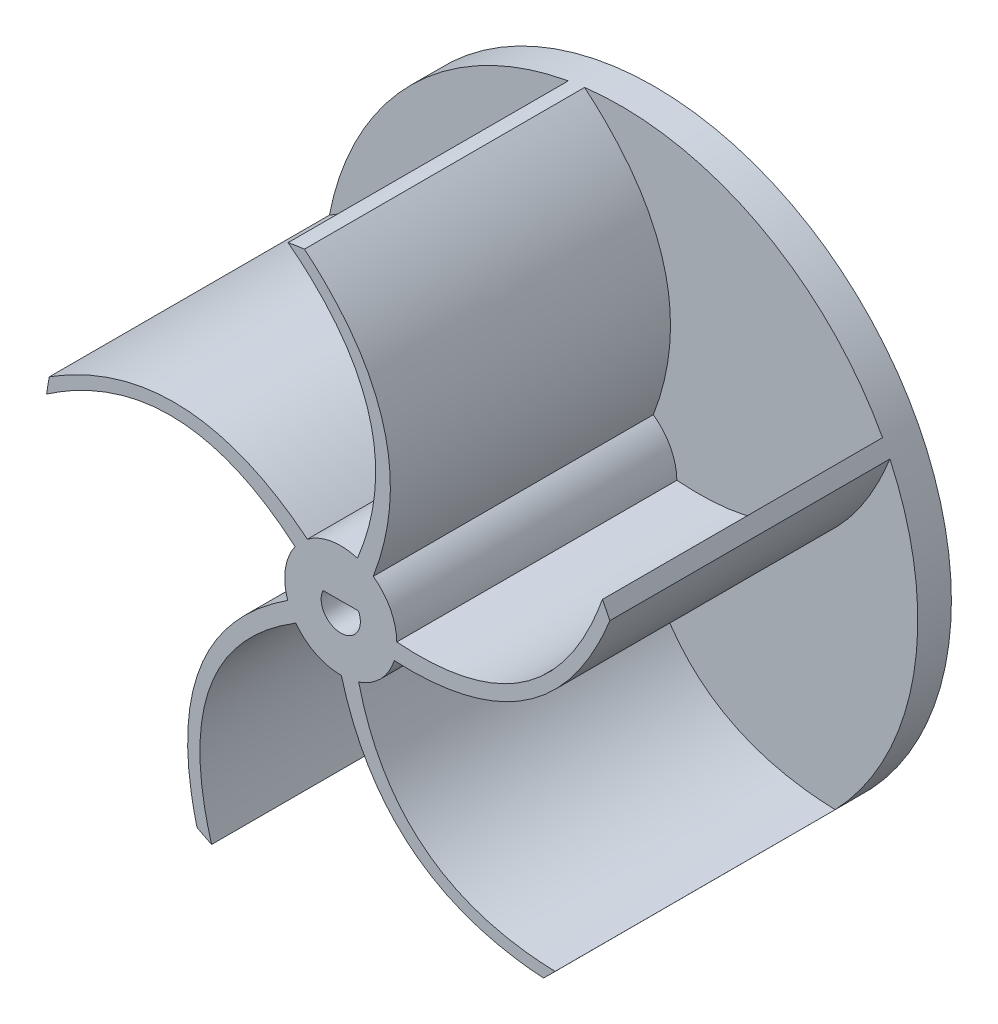
ISO-10303-21;
HEADER;
FILE_DESCRIPTION(('STEP AP214'),'2;1');
FILE_NAME('part.step','',(''),(''),'','','');
FILE_SCHEMA(('AUTOMOTIVE_DESIGN { 1 0 10303 214 1 1 1 1 }'));
ENDSEC;
DATA;
#1=APPLICATION_CONTEXT('core data for automotive mechanical design processes');
#2=APPLICATION_PROTOCOL_DEFINITION('international standard','automotive_design',2000,#1);
#3=PRODUCT_CONTEXT('',#1,'mechanical');
#4=PRODUCT('Part','Part','',(#3));
#5=PRODUCT_RELATED_PRODUCT_CATEGORY('part','',(#4));
#6=PRODUCT_DEFINITION_FORMATION('','',#4);
#7=PRODUCT_DEFINITION_CONTEXT('part definition',#1,'design');
#8=PRODUCT_DEFINITION('design','',#6,#7);
#9=PRODUCT_DEFINITION_SHAPE('','',#8);
#10=(LENGTH_UNIT() NAMED_UNIT(*) SI_UNIT(.MILLI.,.METRE.));
#11=(NAMED_UNIT(*) PLANE_ANGLE_UNIT() SI_UNIT($,.RADIAN.));
#12=(NAMED_UNIT(*) SI_UNIT($,.STERADIAN.) SOLID_ANGLE_UNIT());
#13=UNCERTAINTY_MEASURE_WITH_UNIT(LENGTH_MEASURE(1.E-05),#10,'distance_accuracy_value','');
#14=(GEOMETRIC_REPRESENTATION_CONTEXT(3) GLOBAL_UNCERTAINTY_ASSIGNED_CONTEXT((#13)) GLOBAL_UNIT_ASSIGNED_CONTEXT((#10,
#11,#12)) REPRESENTATION_CONTEXT('',''));
#15=CARTESIAN_POINT('',(0.,0.,0.));
#16=DIRECTION('',(0.,0.,1.));
#17=DIRECTION('',(1.,0.,0.));
#18=AXIS2_PLACEMENT_3D('',#15,#16,#17);
#19=CARTESIAN_POINT('',(0.,0.,3.));
#20=DIRECTION('',(0.,0.,1.));
#21=DIRECTION('',(1.,0.,0.));
#22=AXIS2_PLACEMENT_3D('',#19,#20,#21);
#23=PLANE('',#22);
#24=CARTESIAN_POINT('',(0.,0.,3.));
#25=DIRECTION('',(0.,0.,1.));
#26=DIRECTION('',(1.,0.,0.));
#27=AXIS2_PLACEMENT_3D('',#24,#25,#26);
#28=CIRCLE('',#27,26.5);
#29=CARTESIAN_POINT('',(19.1298908532187,-18.3384098532,3.));
#30=VERTEX_POINT('',#29);
#31=CARTESIAN_POINT('',(24.0121431598113,11.2101284949248,3.));
#32=VERTEX_POINT('',#31);
#33=EDGE_CURVE('E247',#30,#32,#28,.T.);
#34=ORIENTED_EDGE('',*,*,#33,.T.);
#35=CARTESIAN_POINT('',(4.77107145055843,-1.49561934117146,3.));
#36=CARTESIAN_POINT('',(14.0360550496046,-1.95933172216085,3.));
#37=CARTESIAN_POINT('',(20.4497456193296,2.27591755654129,3.));
#38=CARTESIAN_POINT('',(24.0121431598113,11.2101284949248,3.));
#39=B_SPLINE_CURVE_WITH_KNOTS('',3,(#35,#36,#37,#38),.UNSPECIFIED.,.F.,.F.,(4,4),
(0.132924516693897,1.),.UNSPECIFIED.);
#40=CARTESIAN_POINT('',(4.77107145055653,-1.49561934117087,3.));
#41=VERTEX_POINT('',#40);
#42=EDGE_CURVE('E695',#41,#32,#39,.T.);
#43=ORIENTED_EDGE('',*,*,#42,.F.);
#44=CARTESIAN_POINT('',(0.,0.,3.));
#45=DIRECTION('',(0.,0.,1.));
#46=DIRECTION('',(1.,0.,0.));
#47=AXIS2_PLACEMENT_3D('',#44,#45,#46);
#48=CIRCLE('',#47,5.);
#49=CARTESIAN_POINT('',(1.59844943323803,-4.73761115008197,3.));
#50=VERTEX_POINT('',#49);
#51=EDGE_CURVE('E210',#50,#41,#48,.T.);
#52=ORIENTED_EDGE('',*,*,#51,.F.);
#53=CARTESIAN_POINT('',(1.59844943323867,-4.73761115008386,3.));
#54=CARTESIAN_POINT('',(3.70972851772338,-13.523010784881,3.));
#55=CARTESIAN_POINT('',(9.553542324389,-18.0566103526065,3.));
#56=CARTESIAN_POINT('',(19.1298908532187,-18.3384098532,3.));
#57=B_SPLINE_CURVE_WITH_KNOTS('',3,(#53,#54,#55,#56),.UNSPECIFIED.,.F.,.F.,(4,4),
(0.156414662281996,1.),.UNSPECIFIED.);
#58=EDGE_CURVE('E712',#50,#30,#57,.T.);
#59=ORIENTED_EDGE('',*,*,#58,.T.);
#60=EDGE_LOOP('',(#34,#43,#52,#59));
#61=FACE_BOUND('',#60,.T.);
#62=ADVANCED_FACE('F41',(#61),#23,.T.);
#63=CARTESIAN_POINT('',(0.,0.,28.));
#64=DIRECTION('',(0.,0.,-1.));
#65=DIRECTION('',(-1.,0.,0.));
#66=AXIS2_PLACEMENT_3D('',#63,#64,#65);
#67=CYLINDRICAL_SURFACE('',#66,5.);
#68=DIRECTION('',(0.,0.,-1.));
#69=VECTOR('',#68,1.);
#70=CARTESIAN_POINT('',(4.77107145055653,-1.49561934117087,28.));
#71=LINE('',#70,#69);
#72=CARTESIAN_POINT('',(4.77107145055653,-1.49561934117087,28.));
#73=VERTEX_POINT('',#72);
#74=EDGE_CURVE('E195',#73,#41,#71,.T.);
#75=ORIENTED_EDGE('',*,*,#74,.F.);
#76=CARTESIAN_POINT('',(0.,0.,28.));
#77=DIRECTION('',(0.,0.,1.));
#78=DIRECTION('',(1.,0.,0.));
#79=AXIS2_PLACEMENT_3D('',#76,#77,#78);
#80=CIRCLE('',#79,5.);
#81=CARTESIAN_POINT('',(1.59844943323803,-4.73761115008197,28.));
#82=VERTEX_POINT('',#81);
#83=EDGE_CURVE('E208',#82,#73,#80,.T.);
#84=ORIENTED_EDGE('',*,*,#83,.F.);
#85=DIRECTION('',(0.,0.,-1.));
#86=VECTOR('',#85,1.);
#87=CARTESIAN_POINT('',(1.59844943323803,-4.73761115008197,28.));
#88=LINE('',#87,#86);
#89=EDGE_CURVE('E749',#82,#50,#88,.T.);
#90=ORIENTED_EDGE('',*,*,#89,.T.);
#91=ORIENTED_EDGE('',*,*,#51,.T.);
#92=EDGE_LOOP('',(#75,#84,#90,#91));
#93=FACE_BOUND('',#92,.T.);
#94=ADVANCED_FACE('F206',(#93),#67,.T.);
#95=CARTESIAN_POINT('',(-11.5294028151947,-23.8604876464204,3.));
#96=VERTEX_POINT('',#95);
#97=CARTESIAN_POINT('',(18.08162606135,-19.3727850082921,3.));
#98=VERTEX_POINT('',#97);
#99=EDGE_CURVE('E255',#96,#98,#28,.T.);
#100=ORIENTED_EDGE('',*,*,#99,.T.);
#101=CARTESIAN_POINT('',(0.051923639281489,-4.99973038630121,3.));
#102=CARTESIAN_POINT('',(2.47394434236521,-13.9545484177696,3.));
#103=CARTESIAN_POINT('',(8.48384514971659,-18.7455666250742,3.));
#104=CARTESIAN_POINT('',(18.08162606135,-19.3727850082921,3.));
#105=B_SPLINE_CURVE_WITH_KNOTS('',3,(#101,#102,#103,#104),.UNSPECIFIED.,.F.,.F.,(4,4),
(0.132924516693897,1.),.UNSPECIFIED.);
#106=CARTESIAN_POINT('',(0.0519236392814691,-4.99973038629922,3.));
#107=VERTEX_POINT('',#106);
#108=EDGE_CURVE('E719',#107,#98,#105,.T.);
#109=ORIENTED_EDGE('',*,*,#108,.F.);
#110=CARTESIAN_POINT('',(-4.01178791643849,-2.98421810756488,3.));
#111=VERTEX_POINT('',#110);
#112=EDGE_CURVE('E406',#111,#107,#48,.T.);
#113=ORIENTED_EDGE('',*,*,#112,.F.);
#114=CARTESIAN_POINT('',(-4.01178791644009,-2.98421810756607,3.));
#115=CARTESIAN_POINT('',(-11.7147783703968,-7.70700162811067,3.));
#116=CARTESIAN_POINT('',(-14.2206500033324,-14.6657581410737,3.));
#117=CARTESIAN_POINT('',(-11.5294028151947,-23.8604876464204,3.));
#118=B_SPLINE_CURVE_WITH_KNOTS('',3,(#114,#115,#116,#117),.UNSPECIFIED.,.F.,.F.,(4,4),
(0.156414662281996,1.),.UNSPECIFIED.);
#119=EDGE_CURVE('E745',#111,#96,#118,.T.);
#120=ORIENTED_EDGE('',*,*,#119,.T.);
#121=EDGE_LOOP('',(#100,#109,#113,#120));
#122=FACE_BOUND('',#121,.T.);
#123=ADVANCED_FACE('F435',(#122),#23,.T.);
#124=DIRECTION('',(0.,0.,-1.));
#125=VECTOR('',#124,1.);
#126=CARTESIAN_POINT('',(0.0519236392814691,-4.99973038629922,28.));
#127=LINE('',#126,#125);
#128=CARTESIAN_POINT('',(0.0519236392814691,-4.99973038629922,28.));
#129=VERTEX_POINT('',#128);
#130=EDGE_CURVE('E771',#129,#107,#127,.T.);
#131=ORIENTED_EDGE('',*,*,#130,.F.);
#132=CARTESIAN_POINT('',(-4.01178791643849,-2.98421810756488,28.));
#133=VERTEX_POINT('',#132);
#134=EDGE_CURVE('E217',#133,#129,#80,.T.);
#135=ORIENTED_EDGE('',*,*,#134,.F.);
#136=DIRECTION('',(0.,0.,-1.));
#137=VECTOR('',#136,1.);
#138=CARTESIAN_POINT('',(-4.01178791643849,-2.98421810756488,28.));
#139=LINE('',#138,#137);
#140=EDGE_CURVE('E295',#133,#111,#139,.T.);
#141=ORIENTED_EDGE('',*,*,#140,.T.);
#142=ORIENTED_EDGE('',*,*,#112,.T.);
#143=EDGE_LOOP('',(#131,#135,#141,#142));
#144=FACE_BOUND('',#143,.T.);
#145=ADVANCED_FACE('F442',(#144),#67,.T.);
#146=CARTESIAN_POINT('',(-26.2554536629977,3.59181749956531,3.));
#147=VERTEX_POINT('',#146);
#148=CARTESIAN_POINT('',(-12.8370836820312,-23.1831680867936,3.));
#149=VERTEX_POINT('',#148);
#150=EDGE_CURVE('E51',#147,#149,#28,.T.);
#151=ORIENTED_EDGE('',*,*,#150,.T.);
#152=CARTESIAN_POINT('',(-4.73898087666289,-1.5943839721483,3.));
#153=CARTESIAN_POINT('',(-12.5070733597475,-6.66505349767677,3.));
#154=CARTESIAN_POINT('',(-15.2064409615139,-13.8613148692127,3.));
#155=CARTESIAN_POINT('',(-12.8370836820312,-23.1831680867937,3.));
#156=B_SPLINE_CURVE_WITH_KNOTS('',3,(#152,#153,#154,#155),.UNSPECIFIED.,.F.,.F.,(4,4),
(0.132924516693897,1.),.UNSPECIFIED.);
#157=CARTESIAN_POINT('',(-4.738980876661,-1.59438397214767,3.));
#158=VERTEX_POINT('',#157);
#159=EDGE_CURVE('E273',#158,#149,#156,.T.);
#160=ORIENTED_EDGE('',*,*,#159,.F.);
#161=CARTESIAN_POINT('',(-4.07787072125312,2.893262929764,3.));
#162=VERTEX_POINT('',#161);
#163=EDGE_CURVE('E235',#162,#158,#48,.T.);
#164=ORIENTED_EDGE('',*,*,#163,.F.);
#165=CARTESIAN_POINT('',(-4.07787072125474,2.89326292976515,3.));
#166=CARTESIAN_POINT('',(-10.9498597213007,8.75982182735788,3.));
#167=CARTESIAN_POINT('',(-18.3423873685647,8.99267335063755,3.));
#168=CARTESIAN_POINT('',(-26.2554536629977,3.5918174995653,3.));
#169=B_SPLINE_CURVE_WITH_KNOTS('',3,(#165,#166,#167,#168),.UNSPECIFIED.,.F.,.F.,(4,4),
(0.156414662281996,1.),.UNSPECIFIED.);
#170=EDGE_CURVE('E275',#162,#147,#169,.T.);
#171=ORIENTED_EDGE('',*,*,#170,.T.);
#172=EDGE_LOOP('',(#151,#160,#164,#171));
#173=FACE_BOUND('',#172,.T.);
#174=ADVANCED_FACE('F271',(#173),#23,.T.);
#175=DIRECTION('',(0.,0.,-1.));
#176=VECTOR('',#175,1.);
#177=CARTESIAN_POINT('',(-4.738980876661,-1.59438397214767,28.));
#178=LINE('',#177,#176);
#179=CARTESIAN_POINT('',(-4.738980876661,-1.59438397214767,28.));
#180=VERTEX_POINT('',#179);
#181=EDGE_CURVE('E290',#180,#158,#178,.T.);
#182=ORIENTED_EDGE('',*,*,#181,.F.);
#183=CARTESIAN_POINT('',(-4.07787072125312,2.893262929764,28.));
#184=VERTEX_POINT('',#183);
#185=EDGE_CURVE('E223',#184,#180,#80,.T.);
#186=ORIENTED_EDGE('',*,*,#185,.F.);
#187=DIRECTION('',(0.,0.,-1.));
#188=VECTOR('',#187,1.);
#189=CARTESIAN_POINT('',(-4.07787072125312,2.893262929764,28.));
#190=LINE('',#189,#188);
#191=EDGE_CURVE('E359',#184,#162,#190,.T.);
#192=ORIENTED_EDGE('',*,*,#191,.T.);
#193=ORIENTED_EDGE('',*,*,#163,.T.);
#194=EDGE_LOOP('',(#182,#186,#192,#193));
#195=FACE_BOUND('',#194,.T.);
#196=ADVANCED_FACE('F432',(#195),#67,.T.);
#197=CARTESIAN_POINT('',(-4.69735993858562,26.0803529425384,3.));
#198=VERTEX_POINT('',#197);
#199=CARTESIAN_POINT('',(-26.0153800932719,5.04479916375189,3.));
#200=VERTEX_POINT('',#199);
#201=EDGE_CURVE('E11',#198,#200,#28,.T.);
#202=ORIENTED_EDGE('',*,*,#201,.T.);
#203=CARTESIAN_POINT('',(-2.9807748930949,4.01434690039551,3.));
#204=CARTESIAN_POINT('',(-10.2037407784774,9.83531881936906,3.));
#205=CARTESIAN_POINT('',(-17.8819425118507,10.1788029071365,3.));
#206=CARTESIAN_POINT('',(-26.0153800932719,5.04479916375189,3.));
#207=B_SPLINE_CURVE_WITH_KNOTS('',3,(#203,#204,#205,#206),.UNSPECIFIED.,.F.,.F.,(4,4),
(0.132924516693897,1.),.UNSPECIFIED.);
#208=CARTESIAN_POINT('',(-2.98077489309371,4.01434690039391,3.));
#209=VERTEX_POINT('',#208);
#210=EDGE_CURVE('E310',#209,#200,#207,.T.);
#211=ORIENTED_EDGE('',*,*,#210,.F.);
#212=CARTESIAN_POINT('',(1.49152520897603,4.77235293654912,3.));
#213=VERTEX_POINT('',#212);
#214=EDGE_CURVE('E231',#213,#209,#48,.T.);
#215=ORIENTED_EDGE('',*,*,#214,.F.);
#216=CARTESIAN_POINT('',(1.49152520897663,4.77235293655102,3.));
#217=CARTESIAN_POINT('',(4.94739289058964,13.120869252811,3.));
#218=CARTESIAN_POINT('',(2.88443117474282,20.223535921493,3.));
#219=CARTESIAN_POINT('',(-4.69735993858562,26.0803529425384,3.));
#220=B_SPLINE_CURVE_WITH_KNOTS('',3,(#216,#217,#218,#219),.UNSPECIFIED.,.F.,.F.,(4,4),
(0.156414662281996,1.),.UNSPECIFIED.);
#221=EDGE_CURVE('E352',#213,#198,#220,.T.);
#222=ORIENTED_EDGE('',*,*,#221,.T.);
#223=EDGE_LOOP('',(#202,#211,#215,#222));
#224=FACE_BOUND('',#223,.T.);
#225=ADVANCED_FACE('F424',(#224),#23,.T.);
#226=DIRECTION('',(0.,0.,-1.));
#227=VECTOR('',#226,1.);
#228=CARTESIAN_POINT('',(-2.98077489309371,4.01434690039391,28.));
#229=LINE('',#228,#227);
#230=CARTESIAN_POINT('',(-2.98077489309371,4.01434690039391,28.));
#231=VERTEX_POINT('',#230);
#232=EDGE_CURVE('E809',#231,#209,#229,.T.);
#233=ORIENTED_EDGE('',*,*,#232,.F.);
#234=CARTESIAN_POINT('',(1.49152520897603,4.77235293654912,28.));
#235=VERTEX_POINT('',#234);
#236=EDGE_CURVE('E225',#235,#231,#80,.T.);
#237=ORIENTED_EDGE('',*,*,#236,.F.);
#238=DIRECTION('',(0.,0.,-1.));
#239=VECTOR('',#238,1.);
#240=CARTESIAN_POINT('',(1.49152520897603,4.77235293654912,28.));
#241=LINE('',#240,#239);
#242=EDGE_CURVE('E380',#235,#213,#241,.T.);
#243=ORIENTED_EDGE('',*,*,#242,.T.);
#244=ORIENTED_EDGE('',*,*,#214,.T.);
#245=EDGE_LOOP('',(#233,#237,#243,#244));
#246=FACE_BOUND('',#245,.T.);
#247=ADVANCED_FACE('F422',(#246),#67,.T.);
#248=CARTESIAN_POINT('',(4.99968399547958,0.0562133913337931,3.));
#249=CARTESIAN_POINT('',(14.0075166833846,-0.650678667177114,3.));
#250=CARTESIAN_POINT('',(20.1250638727654,3.50615922154974,3.));
#251=CARTESIAN_POINT('',(23.3523255635595,12.5267270575169,3.));
#252=B_SPLINE_CURVE_WITH_KNOTS('',3,(#248,#249,#250,#251),.UNSPECIFIED.,.F.,.F.,(4,4),
(0.156414662281996,1.),.UNSPECIFIED.);
#253=CARTESIAN_POINT('',(4.99968399547759,0.0562133913337712,3.));
#254=VERTEX_POINT('',#253);
#255=CARTESIAN_POINT('',(23.3523255635595,12.5267270575169,3.));
#256=VERTEX_POINT('',#255);
#257=EDGE_CURVE('E419',#254,#256,#252,.T.);
#258=ORIENTED_EDGE('',*,*,#257,.T.);
#259=CARTESIAN_POINT('',(-3.24130544585808,26.3010254364093,3.));
#260=VERTEX_POINT('',#259);
#261=EDGE_CURVE('E52',#256,#260,#28,.T.);
#262=ORIENTED_EDGE('',*,*,#261,.T.);
#263=CARTESIAN_POINT('',(2.89676067991792,4.07538679922549,3.));
#264=CARTESIAN_POINT('',(6.20081474625516,12.7436148182383,3.));
#265=CARTESIAN_POINT('',(4.15479270431858,20.1521610306092,3.));
#266=CARTESIAN_POINT('',(-3.24130544585808,26.3010254364093,3.));
#267=B_SPLINE_CURVE_WITH_KNOTS('',3,(#263,#264,#265,#266),.UNSPECIFIED.,.F.,.F.,(4,4),
(0.132924516693897,1.),.UNSPECIFIED.);
#268=CARTESIAN_POINT('',(2.89676067991677,4.07538679922387,3.));
#269=VERTEX_POINT('',#268);
#270=EDGE_CURVE('E358',#269,#260,#267,.T.);
#271=ORIENTED_EDGE('',*,*,#270,.F.);
#272=EDGE_CURVE('E236',#254,#269,#48,.T.);
#273=ORIENTED_EDGE('',*,*,#272,.F.);
#274=EDGE_LOOP('',(#258,#262,#271,#273));
#275=FACE_BOUND('',#274,.T.);
#276=ADVANCED_FACE('F418',(#275),#23,.T.);
#277=CARTESIAN_POINT('',(0.,0.,0.));
#278=DIRECTION('',(0.,0.,1.));
#279=DIRECTION('',(1.,0.,0.));
#280=AXIS2_PLACEMENT_3D('',#277,#278,#279);
#281=PLANE('',#280);
#282=CARTESIAN_POINT('',(0.,0.,0.));
#283=DIRECTION('',(0.,0.,1.));
#284=DIRECTION('',(1.,0.,0.));
#285=AXIS2_PLACEMENT_3D('',#282,#283,#284);
#286=CIRCLE('',#285,26.5);
#287=CARTESIAN_POINT('',(26.5,0.,0.));
#288=VERTEX_POINT('',#287);
#289=EDGE_CURVE('E45',#288,#288,#286,.T.);
#290=ORIENTED_EDGE('',*,*,#289,.F.);
#291=EDGE_LOOP('',(#290));
#292=FACE_BOUND('',#291,.T.);
#293=CARTESIAN_POINT('',(0.,0.,0.));
#294=DIRECTION('',(0.,0.,1.));
#295=DIRECTION('',(1.,0.,0.));
#296=AXIS2_PLACEMENT_3D('',#293,#294,#295);
#297=CIRCLE('',#296,1.75);
#298=CARTESIAN_POINT('',(-1.58113883008419,0.75,0.));
#299=VERTEX_POINT('',#298);
#300=CARTESIAN_POINT('',(1.58113883008419,0.75,0.));
#301=VERTEX_POINT('',#300);
#302=EDGE_CURVE('E229',#299,#301,#297,.T.);
#303=ORIENTED_EDGE('',*,*,#302,.T.);
#304=DIRECTION('',(1.,0.,0.));
#305=VECTOR('',#304,1.);
#306=CARTESIAN_POINT('',(0.,0.75,0.));
#307=LINE('',#306,#305);
#308=EDGE_CURVE('E385',#299,#301,#307,.T.);
#309=ORIENTED_EDGE('',*,*,#308,.F.);
#310=EDGE_LOOP('',(#303,#309));
#311=FACE_BOUND('',#310,.T.);
#312=ADVANCED_FACE('F421',(#292,#311),#281,.F.);
#313=CARTESIAN_POINT('',(0.,0.,3.));
#314=DIRECTION('',(0.,0.,-1.));
#315=DIRECTION('',(-1.,0.,0.));
#316=AXIS2_PLACEMENT_3D('',#313,#314,#315);
#317=CYLINDRICAL_SURFACE('',#316,26.5);
#318=ORIENTED_EDGE('',*,*,#201,.F.);
#319=DIRECTION('',(0.,0.,-1.));
#320=VECTOR('',#319,1.);
#321=CARTESIAN_POINT('',(-4.69735993858562,26.0803529425384,28.));
#322=LINE('',#321,#320);
#323=CARTESIAN_POINT('',(-4.69735993858562,26.0803529425384,28.));
#324=VERTEX_POINT('',#323);
#325=EDGE_CURVE('E351',#324,#198,#322,.T.);
#326=ORIENTED_EDGE('',*,*,#325,.F.);
#327=CARTESIAN_POINT('',(0.,0.,28.));
#328=DIRECTION('',(0.,0.,1.));
#329=DIRECTION('',(1.,0.,0.));
#330=AXIS2_PLACEMENT_3D('',#327,#328,#329);
#331=CIRCLE('',#330,26.5);
#332=CARTESIAN_POINT('',(-3.24130544585808,26.3010254364093,28.));
#333=VERTEX_POINT('',#332);
#334=EDGE_CURVE('E340',#333,#324,#331,.T.);
#335=ORIENTED_EDGE('',*,*,#334,.F.);
#336=DIRECTION('',(0.,0.,-1.));
#337=VECTOR('',#336,1.);
#338=CARTESIAN_POINT('',(-3.24130544585808,26.3010254364093,28.));
#339=LINE('',#338,#337);
#340=EDGE_CURVE('E372',#333,#260,#339,.T.);
#341=ORIENTED_EDGE('',*,*,#340,.T.);
#342=ORIENTED_EDGE('',*,*,#261,.F.);
#343=DIRECTION('',(0.,0.,-1.));
#344=VECTOR('',#343,1.);
#345=CARTESIAN_POINT('',(23.3523255635595,12.5267270575169,28.));
#346=LINE('',#345,#344);
#347=CARTESIAN_POINT('',(23.3523255635595,12.5267270575169,28.));
#348=VERTEX_POINT('',#347);
#349=EDGE_CURVE('E690',#348,#256,#346,.T.);
#350=ORIENTED_EDGE('',*,*,#349,.F.);
#351=CARTESIAN_POINT('',(0.,0.,28.));
#352=DIRECTION('',(0.,0.,1.));
#353=DIRECTION('',(0.309016994374958,-0.95105651629515,0.));
#354=AXIS2_PLACEMENT_3D('',#351,#352,#353);
#355=CIRCLE('',#354,26.5);
#356=CARTESIAN_POINT('',(24.0121431598113,11.2101284949248,28.));
#357=VERTEX_POINT('',#356);
#358=EDGE_CURVE('E201',#357,#348,#355,.T.);
#359=ORIENTED_EDGE('',*,*,#358,.F.);
#360=DIRECTION('',(0.,0.,-1.));
#361=VECTOR('',#360,1.);
#362=CARTESIAN_POINT('',(24.0121431598113,11.2101284949248,28.));
#363=LINE('',#362,#361);
#364=EDGE_CURVE('E198',#357,#32,#363,.T.);
#365=ORIENTED_EDGE('',*,*,#364,.T.);
#366=ORIENTED_EDGE('',*,*,#33,.F.);
#367=DIRECTION('',(0.,0.,-1.));
#368=VECTOR('',#367,1.);
#369=CARTESIAN_POINT('',(19.1298908532187,-18.3384098532,28.));
#370=LINE('',#369,#368);
#371=CARTESIAN_POINT('',(19.1298908532187,-18.3384098532,28.));
#372=VERTEX_POINT('',#371);
#373=EDGE_CURVE('E772',#372,#30,#370,.T.);
#374=ORIENTED_EDGE('',*,*,#373,.F.);
#375=CARTESIAN_POINT('',(0.,0.,28.));
#376=DIRECTION('',(0.,0.,1.));
#377=DIRECTION('',(-0.809016994374942,-0.58778525229248,0.));
#378=AXIS2_PLACEMENT_3D('',#375,#376,#377);
#379=CIRCLE('',#378,26.5);
#380=CARTESIAN_POINT('',(18.08162606135,-19.3727850082921,28.));
#381=VERTEX_POINT('',#380);
#382=EDGE_CURVE('E769',#381,#372,#379,.T.);
#383=ORIENTED_EDGE('',*,*,#382,.F.);
#384=DIRECTION('',(0.,0.,-1.));
#385=VECTOR('',#384,1.);
#386=CARTESIAN_POINT('',(18.08162606135,-19.3727850082921,28.));
#387=LINE('',#386,#385);
#388=EDGE_CURVE('E767',#381,#98,#387,.T.);
#389=ORIENTED_EDGE('',*,*,#388,.T.);
#390=ORIENTED_EDGE('',*,*,#99,.F.);
#391=DIRECTION('',(0.,0.,-1.));
#392=VECTOR('',#391,1.);
#393=CARTESIAN_POINT('',(-11.5294028151947,-23.8604876464204,28.));
#394=LINE('',#393,#392);
#395=CARTESIAN_POINT('',(-11.5294028151947,-23.8604876464204,28.));
#396=VERTEX_POINT('',#395);
#397=EDGE_CURVE('E291',#396,#96,#394,.T.);
#398=ORIENTED_EDGE('',*,*,#397,.F.);
#399=CARTESIAN_POINT('',(0.,0.,28.));
#400=DIRECTION('',(0.,0.,1.));
#401=DIRECTION('',(-0.809016994374951,0.587785252292469,0.));
#402=AXIS2_PLACEMENT_3D('',#399,#400,#401);
#403=CIRCLE('',#402,26.5);
#404=CARTESIAN_POINT('',(-12.8370836820312,-23.1831680867936,28.));
#405=VERTEX_POINT('',#404);
#406=EDGE_CURVE('E287',#405,#396,#403,.T.);
#407=ORIENTED_EDGE('',*,*,#406,.F.);
#408=DIRECTION('',(0.,0.,-1.));
#409=VECTOR('',#408,1.);
#410=CARTESIAN_POINT('',(-12.8370836820312,-23.1831680867936,28.));
#411=LINE('',#410,#409);
#412=EDGE_CURVE('E285',#405,#149,#411,.T.);
#413=ORIENTED_EDGE('',*,*,#412,.T.);
#414=ORIENTED_EDGE('',*,*,#150,.F.);
#415=DIRECTION('',(0.,0.,-1.));
#416=VECTOR('',#415,1.);
#417=CARTESIAN_POINT('',(-26.2554536629977,3.59181749956531,28.));
#418=LINE('',#417,#416);
#419=CARTESIAN_POINT('',(-26.2554536629977,3.59181749956531,28.));
#420=VERTEX_POINT('',#419);
#421=EDGE_CURVE('E281',#420,#147,#418,.T.);
#422=ORIENTED_EDGE('',*,*,#421,.F.);
#423=CARTESIAN_POINT('',(0.,0.,28.));
#424=DIRECTION('',(0.,0.,1.));
#425=DIRECTION('',(0.309016994374945,0.951056516295155,0.));
#426=AXIS2_PLACEMENT_3D('',#423,#424,#425);
#427=CIRCLE('',#426,26.5);
#428=CARTESIAN_POINT('',(-26.0153800932719,5.04479916375189,28.));
#429=VERTEX_POINT('',#428);
#430=EDGE_CURVE('E816',#429,#420,#427,.T.);
#431=ORIENTED_EDGE('',*,*,#430,.F.);
#432=DIRECTION('',(0.,0.,-1.));
#433=VECTOR('',#432,1.);
#434=CARTESIAN_POINT('',(-26.0153800932719,5.04479916375189,28.));
#435=LINE('',#434,#433);
#436=EDGE_CURVE('E811',#429,#200,#435,.T.);
#437=ORIENTED_EDGE('',*,*,#436,.T.);
#438=EDGE_LOOP('',(#318,#326,#335,#341,#342,#350,#359,#365,#366,#374,#383,#389,#390,#398,#407,
#413,#414,#422,#431,#437));
#439=FACE_BOUND('',#438,.T.);
#440=ORIENTED_EDGE('',*,*,#289,.T.);
#441=EDGE_LOOP('',(#440));
#442=FACE_BOUND('',#441,.T.);
#443=ADVANCED_FACE('F43',(#439,#442),#317,.T.);
#444=CARTESIAN_POINT('',(0.,0.,3.));
#445=DIRECTION('',(0.,0.,-1.));
#446=DIRECTION('',(-1.,0.,0.));
#447=AXIS2_PLACEMENT_3D('',#444,#445,#446);
#448=CYLINDRICAL_SURFACE('',#447,1.75);
#449=DIRECTION('',(0.,0.,1.));
#450=VECTOR('',#449,1.);
#451=CARTESIAN_POINT('',(-1.58113883008419,0.75,0.));
#452=LINE('',#451,#450);
#453=CARTESIAN_POINT('',(-1.58113883008419,0.75,28.));
#454=VERTEX_POINT('',#453);
#455=EDGE_CURVE('E388',#299,#454,#452,.T.);
#456=ORIENTED_EDGE('',*,*,#455,.T.);
#457=CARTESIAN_POINT('',(0.,0.,28.));
#458=DIRECTION('',(0.,0.,1.));
#459=DIRECTION('',(1.,0.,0.));
#460=AXIS2_PLACEMENT_3D('',#457,#458,#459);
#461=CIRCLE('',#460,1.75);
#462=CARTESIAN_POINT('',(1.58113883008419,0.75,28.));
#463=VERTEX_POINT('',#462);
#464=EDGE_CURVE('E224',#463,#454,#461,.F.);
#465=ORIENTED_EDGE('',*,*,#464,.F.);
#466=DIRECTION('',(0.,0.,1.));
#467=VECTOR('',#466,1.);
#468=CARTESIAN_POINT('',(1.58113883008419,0.75,0.));
#469=LINE('',#468,#467);
#470=EDGE_CURVE('E391',#301,#463,#469,.T.);
#471=ORIENTED_EDGE('',*,*,#470,.F.);
#472=ORIENTED_EDGE('',*,*,#302,.F.);
#473=EDGE_LOOP('',(#456,#465,#471,#472));
#474=FACE_BOUND('',#473,.T.);
#475=ADVANCED_FACE('F399',(#474),#448,.F.);
#476=CARTESIAN_POINT('',(4.99968399547759,0.0562133913337712,28.));
#477=VERTEX_POINT('',#476);
#478=CARTESIAN_POINT('',(2.89676067991677,4.07538679922387,28.));
#479=VERTEX_POINT('',#478);
#480=EDGE_CURVE('E218',#477,#479,#80,.T.);
#481=ORIENTED_EDGE('',*,*,#480,.F.);
#482=DIRECTION('',(0.,0.,-1.));
#483=VECTOR('',#482,1.);
#484=CARTESIAN_POINT('',(4.99968399547759,0.0562133913337712,28.));
#485=LINE('',#484,#483);
#486=EDGE_CURVE('E212',#477,#254,#485,.T.);
#487=ORIENTED_EDGE('',*,*,#486,.T.);
#488=ORIENTED_EDGE('',*,*,#272,.T.);
#489=DIRECTION('',(0.,0.,-1.));
#490=VECTOR('',#489,1.);
#491=CARTESIAN_POINT('',(2.89676067991677,4.07538679922387,28.));
#492=LINE('',#491,#490);
#493=EDGE_CURVE('E376',#479,#269,#492,.T.);
#494=ORIENTED_EDGE('',*,*,#493,.F.);
#495=EDGE_LOOP('',(#481,#487,#488,#494));
#496=FACE_BOUND('',#495,.T.);
#497=ADVANCED_FACE('F415',(#496),#67,.T.);
#498=CARTESIAN_POINT('',(0.,0.,28.));
#499=DIRECTION('',(0.,0.,1.));
#500=DIRECTION('',(1.,0.,0.));
#501=AXIS2_PLACEMENT_3D('',#498,#499,#500);
#502=PLANE('',#501);
#503=ORIENTED_EDGE('',*,*,#464,.T.);
#504=DIRECTION('',(1.,0.,0.));
#505=VECTOR('',#504,1.);
#506=CARTESIAN_POINT('',(0.,0.75,28.));
#507=LINE('',#506,#505);
#508=EDGE_CURVE('E384',#454,#463,#507,.T.);
#509=ORIENTED_EDGE('',*,*,#508,.T.);
#510=EDGE_LOOP('',(#503,#509));
#511=FACE_BOUND('',#510,.T.);
#512=ORIENTED_EDGE('',*,*,#236,.T.);
#513=CARTESIAN_POINT('',(-2.9807748930949,4.01434690039551,28.));
#514=CARTESIAN_POINT('',(-10.2037407784774,9.83531881936906,28.));
#515=CARTESIAN_POINT('',(-17.8819425118507,10.1788029071365,28.));
#516=CARTESIAN_POINT('',(-26.0153800932719,5.04479916375189,28.));
#517=B_SPLINE_CURVE_WITH_KNOTS('',3,(#513,#514,#515,#516),.UNSPECIFIED.,.F.,.F.,(4,4),
(0.132924516693897,1.),.UNSPECIFIED.);
#518=EDGE_CURVE('E309',#231,#429,#517,.T.);
#519=ORIENTED_EDGE('',*,*,#518,.T.);
#520=ORIENTED_EDGE('',*,*,#430,.T.);
#521=CARTESIAN_POINT('',(-4.07787072125474,2.89326292976515,28.));
#522=CARTESIAN_POINT('',(-10.9498597213007,8.75982182735788,28.));
#523=CARTESIAN_POINT('',(-18.3423873685647,8.99267335063755,28.));
#524=CARTESIAN_POINT('',(-26.2554536629977,3.5918174995653,28.));
#525=B_SPLINE_CURVE_WITH_KNOTS('',3,(#521,#522,#523,#524),.UNSPECIFIED.,.F.,.F.,(4,4),
(0.156414662281996,1.),.UNSPECIFIED.);
#526=EDGE_CURVE('E303',#184,#420,#525,.T.);
#527=ORIENTED_EDGE('',*,*,#526,.F.);
#528=ORIENTED_EDGE('',*,*,#185,.T.);
#529=CARTESIAN_POINT('',(-4.73898087666289,-1.5943839721483,28.));
#530=CARTESIAN_POINT('',(-12.5070733597475,-6.66505349767677,28.));
#531=CARTESIAN_POINT('',(-15.2064409615139,-13.8613148692127,28.));
#532=CARTESIAN_POINT('',(-12.8370836820312,-23.1831680867937,28.));
#533=B_SPLINE_CURVE_WITH_KNOTS('',3,(#529,#530,#531,#532),.UNSPECIFIED.,.F.,.F.,(4,4),
(0.132924516693897,1.),.UNSPECIFIED.);
#534=EDGE_CURVE('E729',#180,#405,#533,.T.);
#535=ORIENTED_EDGE('',*,*,#534,.T.);
#536=ORIENTED_EDGE('',*,*,#406,.T.);
#537=CARTESIAN_POINT('',(-4.01178791644009,-2.98421810756607,28.));
#538=CARTESIAN_POINT('',(-11.7147783703968,-7.70700162811067,28.));
#539=CARTESIAN_POINT('',(-14.2206500033324,-14.6657581410737,28.));
#540=CARTESIAN_POINT('',(-11.5294028151947,-23.8604876464204,28.));
#541=B_SPLINE_CURVE_WITH_KNOTS('',3,(#537,#538,#539,#540),.UNSPECIFIED.,.F.,.F.,(4,4),
(0.156414662281996,1.),.UNSPECIFIED.);
#542=EDGE_CURVE('E735',#133,#396,#541,.T.);
#543=ORIENTED_EDGE('',*,*,#542,.F.);
#544=ORIENTED_EDGE('',*,*,#134,.T.);
#545=CARTESIAN_POINT('',(0.051923639281489,-4.99973038630121,28.));
#546=CARTESIAN_POINT('',(2.47394434236521,-13.9545484177696,28.));
#547=CARTESIAN_POINT('',(8.48384514971659,-18.7455666250742,28.));
#548=CARTESIAN_POINT('',(18.08162606135,-19.3727850082921,28.));
#549=B_SPLINE_CURVE_WITH_KNOTS('',3,(#545,#546,#547,#548),.UNSPECIFIED.,.F.,.F.,(4,4),
(0.132924516693897,1.),.UNSPECIFIED.);
#550=EDGE_CURVE('E718',#129,#381,#549,.T.);
#551=ORIENTED_EDGE('',*,*,#550,.T.);
#552=ORIENTED_EDGE('',*,*,#382,.T.);
#553=CARTESIAN_POINT('',(1.59844943323867,-4.73761115008386,28.));
#554=CARTESIAN_POINT('',(3.70972851772338,-13.523010784881,28.));
#555=CARTESIAN_POINT('',(9.553542324389,-18.0566103526065,28.));
#556=CARTESIAN_POINT('',(19.1298908532187,-18.3384098532,28.));
#557=B_SPLINE_CURVE_WITH_KNOTS('',3,(#553,#554,#555,#556),.UNSPECIFIED.,.F.,.F.,(4,4),
(0.156414662281996,1.),.UNSPECIFIED.);
#558=EDGE_CURVE('E66',#82,#372,#557,.T.);
#559=ORIENTED_EDGE('',*,*,#558,.F.);
#560=ORIENTED_EDGE('',*,*,#83,.T.);
#561=CARTESIAN_POINT('',(4.77107145055843,-1.49561934117146,28.));
#562=CARTESIAN_POINT('',(14.0360550496046,-1.95933172216085,28.));
#563=CARTESIAN_POINT('',(20.4497456193296,2.27591755654129,28.));
#564=CARTESIAN_POINT('',(24.0121431598113,11.2101284949248,28.));
#565=B_SPLINE_CURVE_WITH_KNOTS('',3,(#561,#562,#563,#564),.UNSPECIFIED.,.F.,.F.,(4,4),
(0.132924516693897,1.),.UNSPECIFIED.);
#566=EDGE_CURVE('E192',#73,#357,#565,.T.);
#567=ORIENTED_EDGE('',*,*,#566,.T.);
#568=ORIENTED_EDGE('',*,*,#358,.T.);
#569=CARTESIAN_POINT('',(4.99968399547958,0.0562133913337931,28.));
#570=CARTESIAN_POINT('',(14.0075166833846,-0.650678667177114,28.));
#571=CARTESIAN_POINT('',(20.1250638727654,3.50615922154974,28.));
#572=CARTESIAN_POINT('',(23.3523255635595,12.5267270575169,28.));
#573=B_SPLINE_CURVE_WITH_KNOTS('',3,(#569,#570,#571,#572),.UNSPECIFIED.,.F.,.F.,(4,4),
(0.156414662281996,1.),.UNSPECIFIED.);
#574=EDGE_CURVE('E59',#477,#348,#573,.T.);
#575=ORIENTED_EDGE('',*,*,#574,.F.);
#576=ORIENTED_EDGE('',*,*,#480,.T.);
#577=CARTESIAN_POINT('',(2.89676067991792,4.07538679922549,28.));
#578=CARTESIAN_POINT('',(6.20081474625516,12.7436148182383,28.));
#579=CARTESIAN_POINT('',(4.15479270431858,20.1521610306092,28.));
#580=CARTESIAN_POINT('',(-3.24130544585808,26.3010254364093,28.));
#581=B_SPLINE_CURVE_WITH_KNOTS('',3,(#577,#578,#579,#580),.UNSPECIFIED.,.F.,.F.,(4,4),
(0.132924516693897,1.),.UNSPECIFIED.);
#582=EDGE_CURVE('E334',#479,#333,#581,.T.);
#583=ORIENTED_EDGE('',*,*,#582,.T.);
#584=ORIENTED_EDGE('',*,*,#334,.T.);
#585=CARTESIAN_POINT('',(1.49152520897663,4.77235293655102,28.));
#586=CARTESIAN_POINT('',(4.94739289058964,13.120869252811,28.));
#587=CARTESIAN_POINT('',(2.88443117474282,20.223535921493,28.));
#588=CARTESIAN_POINT('',(-4.69735993858562,26.0803529425384,28.));
#589=B_SPLINE_CURVE_WITH_KNOTS('',3,(#585,#586,#587,#588),.UNSPECIFIED.,.F.,.F.,(4,4),
(0.156414662281996,1.),.UNSPECIFIED.);
#590=EDGE_CURVE('E341',#235,#324,#589,.T.);
#591=ORIENTED_EDGE('',*,*,#590,.F.);
#592=EDGE_LOOP('',(#512,#519,#520,#527,#528,#535,#536,#543,#544,#551,#552,#559,#560,#567,#568,
#575,#576,#583,#584,#591));
#593=FACE_BOUND('',#592,.T.);
#594=ADVANCED_FACE('F215',(#511,#593),#502,.T.);
#595=CARTESIAN_POINT('',(0.,0.75,0.));
#596=DIRECTION('',(0.,-1.,0.));
#597=DIRECTION('',(1.,0.,0.));
#598=AXIS2_PLACEMENT_3D('',#595,#596,#597);
#599=PLANE('',#598);
#600=ORIENTED_EDGE('',*,*,#508,.F.);
#601=ORIENTED_EDGE('',*,*,#455,.F.);
#602=ORIENTED_EDGE('',*,*,#308,.T.);
#603=ORIENTED_EDGE('',*,*,#470,.T.);
#604=EDGE_LOOP('',(#600,#601,#602,#603));
#605=FACE_BOUND('',#604,.T.);
#606=ADVANCED_FACE('F460',(#605),#599,.T.);
#607=DIRECTION('',(0.,0.,-1.));
#608=VECTOR('',#607,1.);
#609=SURFACE_OF_LINEAR_EXTRUSION('',#589,#608);
#610=ORIENTED_EDGE('',*,*,#221,.F.);
#611=ORIENTED_EDGE('',*,*,#242,.F.);
#612=ORIENTED_EDGE('',*,*,#590,.T.);
#613=ORIENTED_EDGE('',*,*,#325,.T.);
#614=EDGE_LOOP('',(#610,#611,#612,#613));
#615=FACE_BOUND('',#614,.T.);
#616=ADVANCED_FACE('F330',(#615),#609,.T.);
#617=DIRECTION('',(0.,0.,-1.));
#618=VECTOR('',#617,1.);
#619=SURFACE_OF_LINEAR_EXTRUSION('',#581,#618);
#620=ORIENTED_EDGE('',*,*,#270,.T.);
#621=ORIENTED_EDGE('',*,*,#340,.F.);
#622=ORIENTED_EDGE('',*,*,#582,.F.);
#623=ORIENTED_EDGE('',*,*,#493,.T.);
#624=EDGE_LOOP('',(#620,#621,#622,#623));
#625=FACE_BOUND('',#624,.T.);
#626=ADVANCED_FACE('F324',(#625),#619,.F.);
#627=DIRECTION('',(0.,0.,-1.));
#628=VECTOR('',#627,1.);
#629=SURFACE_OF_LINEAR_EXTRUSION('',#525,#628);
#630=ORIENTED_EDGE('',*,*,#170,.F.);
#631=ORIENTED_EDGE('',*,*,#191,.F.);
#632=ORIENTED_EDGE('',*,*,#526,.T.);
#633=ORIENTED_EDGE('',*,*,#421,.T.);
#634=EDGE_LOOP('',(#630,#631,#632,#633));
#635=FACE_BOUND('',#634,.T.);
#636=ADVANCED_FACE('F319',(#635),#629,.T.);
#637=DIRECTION('',(0.,0.,-1.));
#638=VECTOR('',#637,1.);
#639=SURFACE_OF_LINEAR_EXTRUSION('',#517,#638);
#640=ORIENTED_EDGE('',*,*,#210,.T.);
#641=ORIENTED_EDGE('',*,*,#436,.F.);
#642=ORIENTED_EDGE('',*,*,#518,.F.);
#643=ORIENTED_EDGE('',*,*,#232,.T.);
#644=EDGE_LOOP('',(#640,#641,#642,#643));
#645=FACE_BOUND('',#644,.T.);
#646=ADVANCED_FACE('F323',(#645),#639,.F.);
#647=DIRECTION('',(0.,0.,-1.));
#648=VECTOR('',#647,1.);
#649=SURFACE_OF_LINEAR_EXTRUSION('',#541,#648);
#650=ORIENTED_EDGE('',*,*,#119,.F.);
#651=ORIENTED_EDGE('',*,*,#140,.F.);
#652=ORIENTED_EDGE('',*,*,#542,.T.);
#653=ORIENTED_EDGE('',*,*,#397,.T.);
#654=EDGE_LOOP('',(#650,#651,#652,#653));
#655=FACE_BOUND('',#654,.T.);
#656=ADVANCED_FACE('F618',(#655),#649,.T.);
#657=DIRECTION('',(0.,0.,-1.));
#658=VECTOR('',#657,1.);
#659=SURFACE_OF_LINEAR_EXTRUSION('',#533,#658);
#660=ORIENTED_EDGE('',*,*,#159,.T.);
#661=ORIENTED_EDGE('',*,*,#412,.F.);
#662=ORIENTED_EDGE('',*,*,#534,.F.);
#663=ORIENTED_EDGE('',*,*,#181,.T.);
#664=EDGE_LOOP('',(#660,#661,#662,#663));
#665=FACE_BOUND('',#664,.T.);
#666=ADVANCED_FACE('F626',(#665),#659,.F.);
#667=DIRECTION('',(0.,0.,-1.));
#668=VECTOR('',#667,1.);
#669=SURFACE_OF_LINEAR_EXTRUSION('',#557,#668);
#670=ORIENTED_EDGE('',*,*,#58,.F.);
#671=ORIENTED_EDGE('',*,*,#89,.F.);
#672=ORIENTED_EDGE('',*,*,#558,.T.);
#673=ORIENTED_EDGE('',*,*,#373,.T.);
#674=EDGE_LOOP('',(#670,#671,#672,#673));
#675=FACE_BOUND('',#674,.T.);
#676=ADVANCED_FACE('F634',(#675),#669,.T.);
#677=DIRECTION('',(0.,0.,-1.));
#678=VECTOR('',#677,1.);
#679=SURFACE_OF_LINEAR_EXTRUSION('',#549,#678);
#680=ORIENTED_EDGE('',*,*,#108,.T.);
#681=ORIENTED_EDGE('',*,*,#388,.F.);
#682=ORIENTED_EDGE('',*,*,#550,.F.);
#683=ORIENTED_EDGE('',*,*,#130,.T.);
#684=EDGE_LOOP('',(#680,#681,#682,#683));
#685=FACE_BOUND('',#684,.T.);
#686=ADVANCED_FACE('F642',(#685),#679,.F.);
#687=DIRECTION('',(0.,0.,-1.));
#688=VECTOR('',#687,1.);
#689=SURFACE_OF_LINEAR_EXTRUSION('',#573,#688);
#690=ORIENTED_EDGE('',*,*,#257,.F.);
#691=ORIENTED_EDGE('',*,*,#486,.F.);
#692=ORIENTED_EDGE('',*,*,#574,.T.);
#693=ORIENTED_EDGE('',*,*,#349,.T.);
#694=EDGE_LOOP('',(#690,#691,#692,#693));
#695=FACE_BOUND('',#694,.T.);
#696=ADVANCED_FACE('F651',(#695),#689,.T.);
#697=DIRECTION('',(0.,0.,-1.));
#698=VECTOR('',#697,1.);
#699=SURFACE_OF_LINEAR_EXTRUSION('',#565,#698);
#700=ORIENTED_EDGE('',*,*,#42,.T.);
#701=ORIENTED_EDGE('',*,*,#364,.F.);
#702=ORIENTED_EDGE('',*,*,#566,.F.);
#703=ORIENTED_EDGE('',*,*,#74,.T.);
#704=EDGE_LOOP('',(#700,#701,#702,#703));
#705=FACE_BOUND('',#704,.T.);
#706=ADVANCED_FACE('F194',(#705),#699,.F.);
#707=CLOSED_SHELL('',(#62,#94,#123,#145,#174,#196,#225,#247,#276,#312,#443,#475,#497,#594,#606,
#616,#626,#636,#646,#656,#666,#676,#686,#696,#706));
#708=MANIFOLD_SOLID_BREP('B2',#707);
#709=ADVANCED_BREP_SHAPE_REPRESENTATION('',(#18,#708),#14);
#710=SHAPE_DEFINITION_REPRESENTATION(#9,#709);
ENDSEC;
END-ISO-10303-21;
